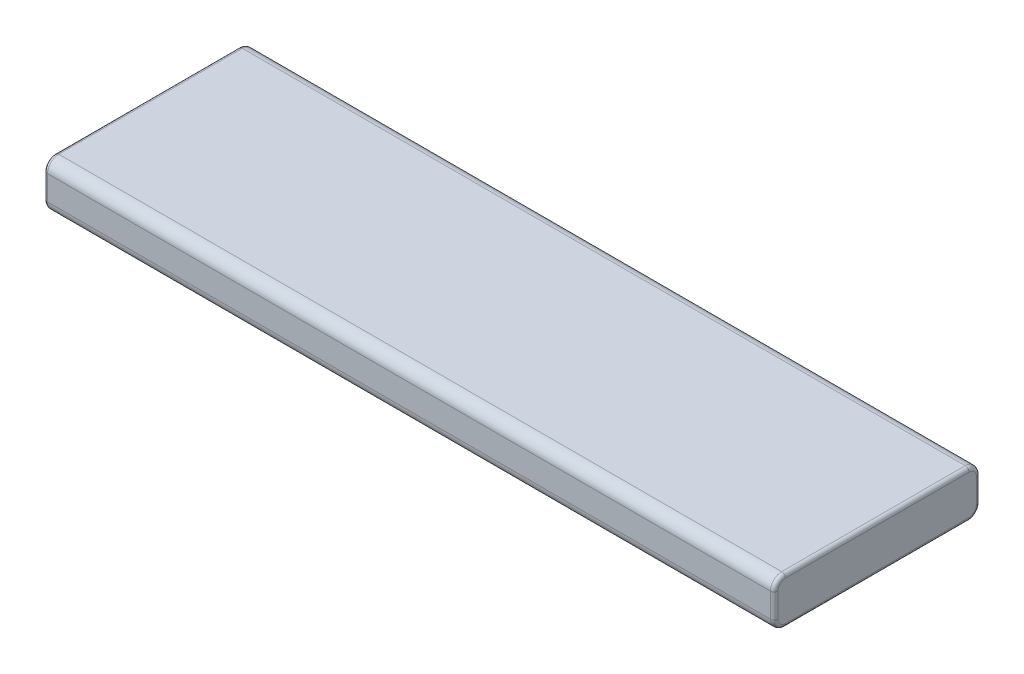
ISO-10303-21;
HEADER;
FILE_DESCRIPTION(('STEP AP214'),'2;1');
FILE_NAME('part.step','',(''),(''),'','','');
FILE_SCHEMA(('AUTOMOTIVE_DESIGN { 1 0 10303 214 1 1 1 1 }'));
ENDSEC;
DATA;
#1=APPLICATION_CONTEXT('core data for automotive mechanical design processes');
#2=APPLICATION_PROTOCOL_DEFINITION('international standard','automotive_design',2000,#1);
#3=PRODUCT_CONTEXT('',#1,'mechanical');
#4=PRODUCT('Part','Part','',(#3));
#5=PRODUCT_RELATED_PRODUCT_CATEGORY('part','',(#4));
#6=PRODUCT_DEFINITION_FORMATION('','',#4);
#7=PRODUCT_DEFINITION_CONTEXT('part definition',#1,'design');
#8=PRODUCT_DEFINITION('design','',#6,#7);
#9=PRODUCT_DEFINITION_SHAPE('','',#8);
#10=(LENGTH_UNIT() NAMED_UNIT(*) SI_UNIT(.MILLI.,.METRE.));
#11=(NAMED_UNIT(*) PLANE_ANGLE_UNIT() SI_UNIT($,.RADIAN.));
#12=(NAMED_UNIT(*) SI_UNIT($,.STERADIAN.) SOLID_ANGLE_UNIT());
#13=UNCERTAINTY_MEASURE_WITH_UNIT(LENGTH_MEASURE(1.E-05),#10,'distance_accuracy_value','');
#14=(GEOMETRIC_REPRESENTATION_CONTEXT(3) GLOBAL_UNCERTAINTY_ASSIGNED_CONTEXT((#13)) GLOBAL_UNIT_ASSIGNED_CONTEXT((#10,
#11,#12)) REPRESENTATION_CONTEXT('',''));
#15=CARTESIAN_POINT('',(0.,0.,0.));
#16=DIRECTION('',(0.,0.,1.));
#17=DIRECTION('',(1.,0.,0.));
#18=AXIS2_PLACEMENT_3D('',#15,#16,#17);
#19=CARTESIAN_POINT('',(0.,5.,0.));
#20=DIRECTION('',(1.,0.,0.));
#21=DIRECTION('',(0.,0.,-1.));
#22=AXIS2_PLACEMENT_3D('',#19,#20,#21);
#23=PLANE('',#22);
#24=DIRECTION('',(0.,0.,1.));
#25=VECTOR('',#24,1.);
#26=CARTESIAN_POINT('',(0.,4.6,0.));
#27=LINE('',#26,#25);
#28=CARTESIAN_POINT('',(0.,4.6,-1.2));
#29=VERTEX_POINT('',#28);
#30=CARTESIAN_POINT('',(0.,4.6,-20.8));
#31=VERTEX_POINT('',#30);
#32=EDGE_CURVE('E225',#29,#31,#27,.F.);
#33=ORIENTED_EDGE('',*,*,#32,.T.);
#34=CARTESIAN_POINT('',(0.,3.8,-20.8));
#35=DIRECTION('',(1.,0.,0.));
#36=DIRECTION('',(0.,0.,-1.));
#37=AXIS2_PLACEMENT_3D('',#34,#35,#36);
#38=CIRCLE('',#37,0.8);
#39=CARTESIAN_POINT('',(0.,3.8,-21.6));
#40=VERTEX_POINT('',#39);
#41=EDGE_CURVE('E238',#31,#40,#38,.F.);
#42=ORIENTED_EDGE('',*,*,#41,.T.);
#43=DIRECTION('',(0.,-1.,0.));
#44=VECTOR('',#43,1.);
#45=CARTESIAN_POINT('',(0.,5.,-21.6));
#46=LINE('',#45,#44);
#47=CARTESIAN_POINT('',(0.,1.2,-21.6));
#48=VERTEX_POINT('',#47);
#49=EDGE_CURVE('E61',#40,#48,#46,.T.);
#50=ORIENTED_EDGE('',*,*,#49,.T.);
#51=CARTESIAN_POINT('',(0.,1.2,-20.8));
#52=DIRECTION('',(1.,0.,0.));
#53=DIRECTION('',(0.,0.,-1.));
#54=AXIS2_PLACEMENT_3D('',#51,#52,#53);
#55=CIRCLE('',#54,0.8);
#56=CARTESIAN_POINT('',(0.,0.4,-20.8));
#57=VERTEX_POINT('',#56);
#58=EDGE_CURVE('E235',#48,#57,#55,.F.);
#59=ORIENTED_EDGE('',*,*,#58,.T.);
#60=DIRECTION('',(0.,0.,1.));
#61=VECTOR('',#60,1.);
#62=CARTESIAN_POINT('',(0.,0.4,-1.2));
#63=LINE('',#62,#61);
#64=CARTESIAN_POINT('',(0.,0.4,-1.2));
#65=VERTEX_POINT('',#64);
#66=EDGE_CURVE('E233',#57,#65,#63,.T.);
#67=ORIENTED_EDGE('',*,*,#66,.T.);
#68=CARTESIAN_POINT('',(0.,1.2,-1.2));
#69=DIRECTION('',(1.,0.,0.));
#70=DIRECTION('',(0.,0.,-1.));
#71=AXIS2_PLACEMENT_3D('',#68,#69,#70);
#72=CIRCLE('',#71,0.8);
#73=CARTESIAN_POINT('',(0.,1.2,-0.4));
#74=VERTEX_POINT('',#73);
#75=EDGE_CURVE('E231',#65,#74,#72,.F.);
#76=ORIENTED_EDGE('',*,*,#75,.T.);
#77=DIRECTION('',(0.,-1.,0.));
#78=VECTOR('',#77,1.);
#79=CARTESIAN_POINT('',(0.,5.,-0.4));
#80=LINE('',#79,#78);
#81=CARTESIAN_POINT('',(0.,3.8,-0.4));
#82=VERTEX_POINT('',#81);
#83=EDGE_CURVE('E229',#74,#82,#80,.F.);
#84=ORIENTED_EDGE('',*,*,#83,.T.);
#85=CARTESIAN_POINT('',(0.,3.8,-1.2));
#86=DIRECTION('',(1.,0.,0.));
#87=DIRECTION('',(0.,0.,-1.));
#88=AXIS2_PLACEMENT_3D('',#85,#86,#87);
#89=CIRCLE('',#88,0.8);
#90=EDGE_CURVE('E227',#82,#29,#89,.F.);
#91=ORIENTED_EDGE('',*,*,#90,.T.);
#92=EDGE_LOOP('',(#33,#42,#50,#59,#67,#76,#84,#91));
#93=FACE_BOUND('',#92,.T.);
#94=ADVANCED_FACE('F37',(#93),#23,.F.);
#95=CARTESIAN_POINT('',(0.,5.,0.));
#96=DIRECTION('',(0.,0.,-1.));
#97=DIRECTION('',(-1.,0.,0.));
#98=AXIS2_PLACEMENT_3D('',#95,#96,#97);
#99=PLANE('',#98);
#100=DIRECTION('',(1.,0.,0.));
#101=VECTOR('',#100,1.);
#102=CARTESIAN_POINT('',(78.,1.2,0.));
#103=LINE('',#102,#101);
#104=CARTESIAN_POINT('',(0.399999999999998,1.2,0.));
#105=VERTEX_POINT('',#104);
#106=CARTESIAN_POINT('',(77.6,1.2,0.));
#107=VERTEX_POINT('',#106);
#108=EDGE_CURVE('E178',#105,#107,#103,.T.);
#109=ORIENTED_EDGE('',*,*,#108,.T.);
#110=DIRECTION('',(0.,-1.,0.));
#111=VECTOR('',#110,1.);
#112=CARTESIAN_POINT('',(77.6,5.,0.));
#113=LINE('',#112,#111);
#114=CARTESIAN_POINT('',(77.6,3.8,0.));
#115=VERTEX_POINT('',#114);
#116=EDGE_CURVE('E203',#107,#115,#113,.F.);
#117=ORIENTED_EDGE('',*,*,#116,.T.);
#118=DIRECTION('',(1.,0.,0.));
#119=VECTOR('',#118,1.);
#120=CARTESIAN_POINT('',(0.,3.8,0.));
#121=LINE('',#120,#119);
#122=CARTESIAN_POINT('',(0.4,3.8,0.));
#123=VERTEX_POINT('',#122);
#124=EDGE_CURVE('E181',#115,#123,#121,.F.);
#125=ORIENTED_EDGE('',*,*,#124,.T.);
#126=DIRECTION('',(0.,-1.,0.));
#127=VECTOR('',#126,1.);
#128=CARTESIAN_POINT('',(0.4,5.,0.));
#129=LINE('',#128,#127);
#130=EDGE_CURVE('E201',#123,#105,#129,.T.);
#131=ORIENTED_EDGE('',*,*,#130,.T.);
#132=EDGE_LOOP('',(#109,#117,#125,#131));
#133=FACE_BOUND('',#132,.T.);
#134=ADVANCED_FACE('F315',(#133),#99,.F.);
#135=CARTESIAN_POINT('',(78.,5.,0.));
#136=DIRECTION('',(-1.,0.,0.));
#137=DIRECTION('',(0.,0.,1.));
#138=AXIS2_PLACEMENT_3D('',#135,#136,#137);
#139=PLANE('',#138);
#140=DIRECTION('',(0.,0.,-1.));
#141=VECTOR('',#140,1.);
#142=CARTESIAN_POINT('',(78.,4.6,0.));
#143=LINE('',#142,#141);
#144=CARTESIAN_POINT('',(78.,4.6,-20.8));
#145=VERTEX_POINT('',#144);
#146=CARTESIAN_POINT('',(78.,4.6,-1.2));
#147=VERTEX_POINT('',#146);
#148=EDGE_CURVE('E157',#145,#147,#143,.F.);
#149=ORIENTED_EDGE('',*,*,#148,.T.);
#150=CARTESIAN_POINT('',(78.,3.8,-1.2));
#151=DIRECTION('',(-1.,0.,0.));
#152=DIRECTION('',(0.,0.,1.));
#153=AXIS2_PLACEMENT_3D('',#150,#151,#152);
#154=CIRCLE('',#153,0.8);
#155=CARTESIAN_POINT('',(78.,3.8,-0.4));
#156=VERTEX_POINT('',#155);
#157=EDGE_CURVE('E194',#147,#156,#154,.F.);
#158=ORIENTED_EDGE('',*,*,#157,.T.);
#159=DIRECTION('',(0.,-1.,0.));
#160=VECTOR('',#159,1.);
#161=CARTESIAN_POINT('',(78.,5.,-0.4));
#162=LINE('',#161,#160);
#163=CARTESIAN_POINT('',(78.,1.2,-0.4));
#164=VERTEX_POINT('',#163);
#165=EDGE_CURVE('E192',#156,#164,#162,.T.);
#166=ORIENTED_EDGE('',*,*,#165,.T.);
#167=CARTESIAN_POINT('',(78.,1.2,-1.2));
#168=DIRECTION('',(-1.,0.,0.));
#169=DIRECTION('',(0.,0.,1.));
#170=AXIS2_PLACEMENT_3D('',#167,#168,#169);
#171=CIRCLE('',#170,0.8);
#172=CARTESIAN_POINT('',(78.,0.4,-1.2));
#173=VERTEX_POINT('',#172);
#174=EDGE_CURVE('E190',#164,#173,#171,.F.);
#175=ORIENTED_EDGE('',*,*,#174,.T.);
#176=DIRECTION('',(0.,0.,-1.));
#177=VECTOR('',#176,1.);
#178=CARTESIAN_POINT('',(78.,0.4,-20.8));
#179=LINE('',#178,#177);
#180=CARTESIAN_POINT('',(78.,0.4,-20.8));
#181=VERTEX_POINT('',#180);
#182=EDGE_CURVE('E188',#173,#181,#179,.T.);
#183=ORIENTED_EDGE('',*,*,#182,.T.);
#184=CARTESIAN_POINT('',(78.,1.2,-20.8));
#185=DIRECTION('',(-1.,0.,0.));
#186=DIRECTION('',(0.,0.,1.));
#187=AXIS2_PLACEMENT_3D('',#184,#185,#186);
#188=CIRCLE('',#187,0.8);
#189=CARTESIAN_POINT('',(78.,1.2,-21.6));
#190=VERTEX_POINT('',#189);
#191=EDGE_CURVE('E186',#181,#190,#188,.F.);
#192=ORIENTED_EDGE('',*,*,#191,.T.);
#193=DIRECTION('',(0.,-1.,0.));
#194=VECTOR('',#193,1.);
#195=CARTESIAN_POINT('',(78.,5.,-21.6));
#196=LINE('',#195,#194);
#197=CARTESIAN_POINT('',(78.,3.8,-21.6));
#198=VERTEX_POINT('',#197);
#199=EDGE_CURVE('E160',#190,#198,#196,.F.);
#200=ORIENTED_EDGE('',*,*,#199,.T.);
#201=CARTESIAN_POINT('',(78.,3.8,-20.8));
#202=DIRECTION('',(-1.,0.,0.));
#203=DIRECTION('',(0.,0.,1.));
#204=AXIS2_PLACEMENT_3D('',#201,#202,#203);
#205=CIRCLE('',#204,0.8);
#206=EDGE_CURVE('E152',#198,#145,#205,.F.);
#207=ORIENTED_EDGE('',*,*,#206,.T.);
#208=EDGE_LOOP('',(#149,#158,#166,#175,#183,#192,#200,#207));
#209=FACE_BOUND('',#208,.T.);
#210=ADVANCED_FACE('F154',(#209),#139,.F.);
#211=CARTESIAN_POINT('',(0.,5.,-22.));
#212=DIRECTION('',(0.,0.,1.));
#213=DIRECTION('',(1.,0.,0.));
#214=AXIS2_PLACEMENT_3D('',#211,#212,#213);
#215=PLANE('',#214);
#216=DIRECTION('',(-1.,0.,0.));
#217=VECTOR('',#216,1.);
#218=CARTESIAN_POINT('',(0.,3.8,-22.));
#219=LINE('',#218,#217);
#220=CARTESIAN_POINT('',(0.4,3.8,-22.));
#221=VERTEX_POINT('',#220);
#222=CARTESIAN_POINT('',(77.6,3.8,-22.));
#223=VERTEX_POINT('',#222);
#224=EDGE_CURVE('E256',#221,#223,#219,.F.);
#225=ORIENTED_EDGE('',*,*,#224,.T.);
#226=DIRECTION('',(0.,-1.,0.));
#227=VECTOR('',#226,1.);
#228=CARTESIAN_POINT('',(77.6,5.,-22.));
#229=LINE('',#228,#227);
#230=CARTESIAN_POINT('',(77.6,1.2,-22.));
#231=VERTEX_POINT('',#230);
#232=EDGE_CURVE('E219',#223,#231,#229,.T.);
#233=ORIENTED_EDGE('',*,*,#232,.T.);
#234=DIRECTION('',(-1.,0.,0.));
#235=VECTOR('',#234,1.);
#236=CARTESIAN_POINT('',(0.,1.2,-22.));
#237=LINE('',#236,#235);
#238=CARTESIAN_POINT('',(0.4,1.2,-22.));
#239=VERTEX_POINT('',#238);
#240=EDGE_CURVE('E300',#231,#239,#237,.T.);
#241=ORIENTED_EDGE('',*,*,#240,.T.);
#242=DIRECTION('',(0.,-1.,0.));
#243=VECTOR('',#242,1.);
#244=CARTESIAN_POINT('',(0.4,5.,-22.));
#245=LINE('',#244,#243);
#246=EDGE_CURVE('E217',#239,#221,#245,.F.);
#247=ORIENTED_EDGE('',*,*,#246,.T.);
#248=EDGE_LOOP('',(#225,#233,#241,#247));
#249=FACE_BOUND('',#248,.T.);
#250=ADVANCED_FACE('F348',(#249),#215,.F.);
#251=CARTESIAN_POINT('',(0.,5.,0.));
#252=DIRECTION('',(0.,-1.,0.));
#253=DIRECTION('',(0.,0.,-1.));
#254=AXIS2_PLACEMENT_3D('',#251,#252,#253);
#255=PLANE('',#254);
#256=DIRECTION('',(1.,0.,0.));
#257=VECTOR('',#256,1.);
#258=CARTESIAN_POINT('',(0.,5.,-1.2));
#259=LINE('',#258,#257);
#260=CARTESIAN_POINT('',(0.4,5.,-1.2));
#261=VERTEX_POINT('',#260);
#262=CARTESIAN_POINT('',(77.6,5.,-1.2));
#263=VERTEX_POINT('',#262);
#264=EDGE_CURVE('E302',#261,#263,#259,.T.);
#265=ORIENTED_EDGE('',*,*,#264,.T.);
#266=DIRECTION('',(0.,0.,-1.));
#267=VECTOR('',#266,1.);
#268=CARTESIAN_POINT('',(77.6,5.,0.));
#269=LINE('',#268,#267);
#270=CARTESIAN_POINT('',(77.6,5.,-20.8));
#271=VERTEX_POINT('',#270);
#272=EDGE_CURVE('E11',#263,#271,#269,.T.);
#273=ORIENTED_EDGE('',*,*,#272,.T.);
#274=DIRECTION('',(-1.,0.,0.));
#275=VECTOR('',#274,1.);
#276=CARTESIAN_POINT('',(0.,5.,-20.8));
#277=LINE('',#276,#275);
#278=CARTESIAN_POINT('',(0.4,5.,-20.8));
#279=VERTEX_POINT('',#278);
#280=EDGE_CURVE('E310',#271,#279,#277,.T.);
#281=ORIENTED_EDGE('',*,*,#280,.T.);
#282=DIRECTION('',(0.,0.,1.));
#283=VECTOR('',#282,1.);
#284=CARTESIAN_POINT('',(0.4,5.,0.));
#285=LINE('',#284,#283);
#286=EDGE_CURVE('E46',#279,#261,#285,.T.);
#287=ORIENTED_EDGE('',*,*,#286,.T.);
#288=EDGE_LOOP('',(#265,#273,#281,#287));
#289=FACE_BOUND('',#288,.T.);
#290=ADVANCED_FACE('F371',(#289),#255,.F.);
#291=CARTESIAN_POINT('',(0.,0.,0.));
#292=DIRECTION('',(0.,-1.,0.));
#293=DIRECTION('',(0.,0.,-1.));
#294=AXIS2_PLACEMENT_3D('',#291,#292,#293);
#295=PLANE('',#294);
#296=DIRECTION('',(-1.,0.,0.));
#297=VECTOR('',#296,1.);
#298=CARTESIAN_POINT('',(78.,0.,-20.8));
#299=LINE('',#298,#297);
#300=CARTESIAN_POINT('',(0.399999999999998,0.,-20.8));
#301=VERTEX_POINT('',#300);
#302=CARTESIAN_POINT('',(77.6,0.,-20.8));
#303=VERTEX_POINT('',#302);
#304=EDGE_CURVE('E299',#301,#303,#299,.F.);
#305=ORIENTED_EDGE('',*,*,#304,.T.);
#306=DIRECTION('',(0.,0.,-1.));
#307=VECTOR('',#306,1.);
#308=CARTESIAN_POINT('',(77.6,0.,-1.2));
#309=LINE('',#308,#307);
#310=CARTESIAN_POINT('',(77.6,0.,-1.2));
#311=VERTEX_POINT('',#310);
#312=EDGE_CURVE('E211',#303,#311,#309,.F.);
#313=ORIENTED_EDGE('',*,*,#312,.T.);
#314=DIRECTION('',(1.,0.,0.));
#315=VECTOR('',#314,1.);
#316=CARTESIAN_POINT('',(0.,0.,-1.2));
#317=LINE('',#316,#315);
#318=CARTESIAN_POINT('',(0.4,0.,-1.2));
#319=VERTEX_POINT('',#318);
#320=EDGE_CURVE('E292',#311,#319,#317,.F.);
#321=ORIENTED_EDGE('',*,*,#320,.T.);
#322=DIRECTION('',(0.,0.,1.));
#323=VECTOR('',#322,1.);
#324=CARTESIAN_POINT('',(0.4,0.,-20.8));
#325=LINE('',#324,#323);
#326=EDGE_CURVE('E209',#319,#301,#325,.F.);
#327=ORIENTED_EDGE('',*,*,#326,.T.);
#328=EDGE_LOOP('',(#305,#313,#321,#327));
#329=FACE_BOUND('',#328,.T.);
#330=ADVANCED_FACE('F296',(#329),#295,.T.);
#331=CARTESIAN_POINT('',(0.,1.2,-20.8));
#332=DIRECTION('',(1.,0.,0.));
#333=DIRECTION('',(0.,0.,-1.));
#334=AXIS2_PLACEMENT_3D('',#331,#332,#333);
#335=CYLINDRICAL_SURFACE('',#334,1.2);
#336=ORIENTED_EDGE('',*,*,#240,.F.);
#337=CARTESIAN_POINT('',(77.6,1.2,-20.8));
#338=DIRECTION('',(-1.,0.,0.));
#339=DIRECTION('',(0.,0.,1.));
#340=AXIS2_PLACEMENT_3D('',#337,#338,#339);
#341=CIRCLE('',#340,1.2);
#342=EDGE_CURVE('E215',#231,#303,#341,.T.);
#343=ORIENTED_EDGE('',*,*,#342,.T.);
#344=ORIENTED_EDGE('',*,*,#304,.F.);
#345=CARTESIAN_POINT('',(0.4,1.2,-20.8));
#346=DIRECTION('',(1.,0.,0.));
#347=DIRECTION('',(0.,0.,-1.));
#348=AXIS2_PLACEMENT_3D('',#345,#346,#347);
#349=CIRCLE('',#348,1.2);
#350=EDGE_CURVE('E213',#301,#239,#349,.T.);
#351=ORIENTED_EDGE('',*,*,#350,.T.);
#352=EDGE_LOOP('',(#336,#343,#344,#351));
#353=FACE_BOUND('',#352,.T.);
#354=ADVANCED_FACE('F352',(#353),#335,.T.);
#355=CARTESIAN_POINT('',(0.,3.8,-20.8));
#356=DIRECTION('',(-1.,0.,0.));
#357=DIRECTION('',(0.,0.,1.));
#358=AXIS2_PLACEMENT_3D('',#355,#356,#357);
#359=CYLINDRICAL_SURFACE('',#358,1.2);
#360=ORIENTED_EDGE('',*,*,#280,.F.);
#361=CARTESIAN_POINT('',(77.6,3.8,-20.8));
#362=DIRECTION('',(-1.,0.,0.));
#363=DIRECTION('',(0.,0.,1.));
#364=AXIS2_PLACEMENT_3D('',#361,#362,#363);
#365=CIRCLE('',#364,1.2);
#366=EDGE_CURVE('E169',#271,#223,#365,.T.);
#367=ORIENTED_EDGE('',*,*,#366,.T.);
#368=ORIENTED_EDGE('',*,*,#224,.F.);
#369=CARTESIAN_POINT('',(0.4,3.8,-20.8));
#370=DIRECTION('',(1.,0.,0.));
#371=DIRECTION('',(0.,0.,-1.));
#372=AXIS2_PLACEMENT_3D('',#369,#370,#371);
#373=CIRCLE('',#372,1.2);
#374=EDGE_CURVE('E221',#221,#279,#373,.T.);
#375=ORIENTED_EDGE('',*,*,#374,.T.);
#376=EDGE_LOOP('',(#360,#367,#368,#375));
#377=FACE_BOUND('',#376,.T.);
#378=ADVANCED_FACE('F362',(#377),#359,.T.);
#379=CARTESIAN_POINT('',(0.,1.2,-1.2));
#380=DIRECTION('',(-1.,0.,0.));
#381=DIRECTION('',(0.,0.,1.));
#382=AXIS2_PLACEMENT_3D('',#379,#380,#381);
#383=CYLINDRICAL_SURFACE('',#382,1.2);
#384=ORIENTED_EDGE('',*,*,#320,.F.);
#385=CARTESIAN_POINT('',(77.6,1.2,-1.2));
#386=DIRECTION('',(-1.,0.,0.));
#387=DIRECTION('',(0.,0.,1.));
#388=AXIS2_PLACEMENT_3D('',#385,#386,#387);
#389=CIRCLE('',#388,1.2);
#390=EDGE_CURVE('E207',#311,#107,#389,.T.);
#391=ORIENTED_EDGE('',*,*,#390,.T.);
#392=ORIENTED_EDGE('',*,*,#108,.F.);
#393=CARTESIAN_POINT('',(0.4,1.2,-1.2));
#394=DIRECTION('',(1.,0.,0.));
#395=DIRECTION('',(0.,0.,-1.));
#396=AXIS2_PLACEMENT_3D('',#393,#394,#395);
#397=CIRCLE('',#396,1.2);
#398=EDGE_CURVE('E205',#105,#319,#397,.T.);
#399=ORIENTED_EDGE('',*,*,#398,.T.);
#400=EDGE_LOOP('',(#384,#391,#392,#399));
#401=FACE_BOUND('',#400,.T.);
#402=ADVANCED_FACE('F291',(#401),#383,.T.);
#403=CARTESIAN_POINT('',(0.,3.8,-1.2));
#404=DIRECTION('',(1.,0.,0.));
#405=DIRECTION('',(0.,0.,-1.));
#406=AXIS2_PLACEMENT_3D('',#403,#404,#405);
#407=CYLINDRICAL_SURFACE('',#406,1.2);
#408=ORIENTED_EDGE('',*,*,#124,.F.);
#409=CARTESIAN_POINT('',(77.6,3.8,-1.2));
#410=DIRECTION('',(-1.,0.,0.));
#411=DIRECTION('',(0.,0.,1.));
#412=AXIS2_PLACEMENT_3D('',#409,#410,#411);
#413=CIRCLE('',#412,1.2);
#414=EDGE_CURVE('E198',#115,#263,#413,.T.);
#415=ORIENTED_EDGE('',*,*,#414,.T.);
#416=ORIENTED_EDGE('',*,*,#264,.F.);
#417=CARTESIAN_POINT('',(0.4,3.8,-1.2));
#418=DIRECTION('',(1.,0.,0.));
#419=DIRECTION('',(0.,0.,-1.));
#420=AXIS2_PLACEMENT_3D('',#417,#418,#419);
#421=CIRCLE('',#420,1.2);
#422=EDGE_CURVE('E196',#261,#123,#421,.T.);
#423=ORIENTED_EDGE('',*,*,#422,.T.);
#424=EDGE_LOOP('',(#408,#415,#416,#423));
#425=FACE_BOUND('',#424,.T.);
#426=ADVANCED_FACE('F319',(#425),#407,.T.);
#427=CARTESIAN_POINT('',(77.6,1.2,-20.8));
#428=DIRECTION('',(-1.,0.,0.));
#429=DIRECTION('',(0.,0.,1.));
#430=AXIS2_PLACEMENT_3D('',#427,#428,#429);
#431=TOROIDAL_SURFACE('',#430,0.8,0.4);
#432=CARTESIAN_POINT('',(77.6,0.4,-20.8));
#433=DIRECTION('',(0.,0.,1.));
#434=DIRECTION('',(1.,0.,0.));
#435=AXIS2_PLACEMENT_3D('',#432,#433,#434);
#436=CIRCLE('',#435,0.4);
#437=EDGE_CURVE('E250',#303,#181,#436,.T.);
#438=ORIENTED_EDGE('',*,*,#437,.F.);
#439=ORIENTED_EDGE('',*,*,#342,.F.);
#440=CARTESIAN_POINT('',(77.6,1.2,-21.6));
#441=DIRECTION('',(0.,1.,0.));
#442=DIRECTION('',(0.,0.,1.));
#443=AXIS2_PLACEMENT_3D('',#440,#441,#442);
#444=CIRCLE('',#443,0.4);
#445=EDGE_CURVE('E253',#190,#231,#444,.T.);
#446=ORIENTED_EDGE('',*,*,#445,.F.);
#447=ORIENTED_EDGE('',*,*,#191,.F.);
#448=EDGE_LOOP('',(#438,#439,#446,#447));
#449=FACE_BOUND('',#448,.T.);
#450=ADVANCED_FACE('F340',(#449),#431,.T.);
#451=CARTESIAN_POINT('',(77.6,5.,-21.6));
#452=DIRECTION('',(0.,-1.,0.));
#453=DIRECTION('',(0.,0.,-1.));
#454=AXIS2_PLACEMENT_3D('',#451,#452,#453);
#455=CYLINDRICAL_SURFACE('',#454,0.4);
#456=ORIENTED_EDGE('',*,*,#445,.T.);
#457=ORIENTED_EDGE('',*,*,#232,.F.);
#458=CARTESIAN_POINT('',(77.6,3.8,-21.6));
#459=DIRECTION('',(0.,1.,0.));
#460=DIRECTION('',(0.,0.,1.));
#461=AXIS2_PLACEMENT_3D('',#458,#459,#460);
#462=CIRCLE('',#461,0.4);
#463=EDGE_CURVE('E248',#198,#223,#462,.T.);
#464=ORIENTED_EDGE('',*,*,#463,.F.);
#465=ORIENTED_EDGE('',*,*,#199,.F.);
#466=EDGE_LOOP('',(#456,#457,#464,#465));
#467=FACE_BOUND('',#466,.T.);
#468=ADVANCED_FACE('F344',(#467),#455,.T.);
#469=CARTESIAN_POINT('',(77.6,0.4,0.));
#470=DIRECTION('',(0.,0.,1.));
#471=DIRECTION('',(1.,0.,0.));
#472=AXIS2_PLACEMENT_3D('',#469,#470,#471);
#473=CYLINDRICAL_SURFACE('',#472,0.4);
#474=ORIENTED_EDGE('',*,*,#437,.T.);
#475=ORIENTED_EDGE('',*,*,#182,.F.);
#476=CARTESIAN_POINT('',(77.6,0.4,-1.2));
#477=DIRECTION('',(0.,0.,1.));
#478=DIRECTION('',(1.,0.,0.));
#479=AXIS2_PLACEMENT_3D('',#476,#477,#478);
#480=CIRCLE('',#479,0.4);
#481=EDGE_CURVE('E172',#311,#173,#480,.T.);
#482=ORIENTED_EDGE('',*,*,#481,.F.);
#483=ORIENTED_EDGE('',*,*,#312,.F.);
#484=EDGE_LOOP('',(#474,#475,#482,#483));
#485=FACE_BOUND('',#484,.T.);
#486=ADVANCED_FACE('F335',(#485),#473,.T.);
#487=CARTESIAN_POINT('',(77.6,3.8,-20.8));
#488=DIRECTION('',(-1.,0.,0.));
#489=DIRECTION('',(0.,0.,1.));
#490=AXIS2_PLACEMENT_3D('',#487,#488,#489);
#491=TOROIDAL_SURFACE('',#490,0.8,0.4);
#492=ORIENTED_EDGE('',*,*,#463,.T.);
#493=ORIENTED_EDGE('',*,*,#366,.F.);
#494=CARTESIAN_POINT('',(77.6,4.6,-20.8));
#495=DIRECTION('',(0.,0.,1.));
#496=DIRECTION('',(1.,0.,0.));
#497=AXIS2_PLACEMENT_3D('',#494,#495,#496);
#498=CIRCLE('',#497,0.4);
#499=EDGE_CURVE('E167',#145,#271,#498,.T.);
#500=ORIENTED_EDGE('',*,*,#499,.F.);
#501=ORIENTED_EDGE('',*,*,#206,.F.);
#502=EDGE_LOOP('',(#492,#493,#500,#501));
#503=FACE_BOUND('',#502,.T.);
#504=ADVANCED_FACE('F168',(#503),#491,.T.);
#505=CARTESIAN_POINT('',(77.6,1.2,-1.2));
#506=DIRECTION('',(-1.,0.,0.));
#507=DIRECTION('',(0.,0.,1.));
#508=AXIS2_PLACEMENT_3D('',#505,#506,#507);
#509=TOROIDAL_SURFACE('',#508,0.8,0.4);
#510=ORIENTED_EDGE('',*,*,#481,.T.);
#511=ORIENTED_EDGE('',*,*,#174,.F.);
#512=CARTESIAN_POINT('',(77.6,1.2,-0.4));
#513=DIRECTION('',(0.,1.,0.));
#514=DIRECTION('',(0.,0.,1.));
#515=AXIS2_PLACEMENT_3D('',#512,#513,#514);
#516=CIRCLE('',#515,0.4);
#517=EDGE_CURVE('E173',#107,#164,#516,.T.);
#518=ORIENTED_EDGE('',*,*,#517,.F.);
#519=ORIENTED_EDGE('',*,*,#390,.F.);
#520=EDGE_LOOP('',(#510,#511,#518,#519));
#521=FACE_BOUND('',#520,.T.);
#522=ADVANCED_FACE('F332',(#521),#509,.T.);
#523=CARTESIAN_POINT('',(77.6,4.6,0.));
#524=DIRECTION('',(0.,0.,-1.));
#525=DIRECTION('',(-1.,0.,0.));
#526=AXIS2_PLACEMENT_3D('',#523,#524,#525);
#527=CYLINDRICAL_SURFACE('',#526,0.4);
#528=ORIENTED_EDGE('',*,*,#499,.T.);
#529=ORIENTED_EDGE('',*,*,#272,.F.);
#530=CARTESIAN_POINT('',(77.6,4.6,-1.2));
#531=DIRECTION('',(0.,0.,1.));
#532=DIRECTION('',(1.,0.,0.));
#533=AXIS2_PLACEMENT_3D('',#530,#531,#532);
#534=CIRCLE('',#533,0.4);
#535=EDGE_CURVE('E176',#147,#263,#534,.T.);
#536=ORIENTED_EDGE('',*,*,#535,.F.);
#537=ORIENTED_EDGE('',*,*,#148,.F.);
#538=EDGE_LOOP('',(#528,#529,#536,#537));
#539=FACE_BOUND('',#538,.T.);
#540=ADVANCED_FACE('F175',(#539),#527,.T.);
#541=CARTESIAN_POINT('',(77.6,5.,-0.4));
#542=DIRECTION('',(0.,-1.,0.));
#543=DIRECTION('',(0.,0.,-1.));
#544=AXIS2_PLACEMENT_3D('',#541,#542,#543);
#545=CYLINDRICAL_SURFACE('',#544,0.4);
#546=ORIENTED_EDGE('',*,*,#517,.T.);
#547=ORIENTED_EDGE('',*,*,#165,.F.);
#548=CARTESIAN_POINT('',(77.6,3.8,-0.4));
#549=DIRECTION('',(0.,1.,0.));
#550=DIRECTION('',(0.,0.,1.));
#551=AXIS2_PLACEMENT_3D('',#548,#549,#550);
#552=CIRCLE('',#551,0.4);
#553=EDGE_CURVE('E241',#115,#156,#552,.T.);
#554=ORIENTED_EDGE('',*,*,#553,.F.);
#555=ORIENTED_EDGE('',*,*,#116,.F.);
#556=EDGE_LOOP('',(#546,#547,#554,#555));
#557=FACE_BOUND('',#556,.T.);
#558=ADVANCED_FACE('F327',(#557),#545,.T.);
#559=CARTESIAN_POINT('',(77.6,3.8,-1.2));
#560=DIRECTION('',(-1.,0.,0.));
#561=DIRECTION('',(0.,0.,1.));
#562=AXIS2_PLACEMENT_3D('',#559,#560,#561);
#563=TOROIDAL_SURFACE('',#562,0.8,0.4);
#564=ORIENTED_EDGE('',*,*,#535,.T.);
#565=ORIENTED_EDGE('',*,*,#414,.F.);
#566=ORIENTED_EDGE('',*,*,#553,.T.);
#567=ORIENTED_EDGE('',*,*,#157,.F.);
#568=EDGE_LOOP('',(#564,#565,#566,#567));
#569=FACE_BOUND('',#568,.T.);
#570=ADVANCED_FACE('F324',(#569),#563,.T.);
#571=CARTESIAN_POINT('',(0.4,1.2,-1.2));
#572=DIRECTION('',(1.,0.,0.));
#573=DIRECTION('',(0.,0.,-1.));
#574=AXIS2_PLACEMENT_3D('',#571,#572,#573);
#575=TOROIDAL_SURFACE('',#574,0.8,0.4);
#576=CARTESIAN_POINT('',(0.4,0.4,-1.2));
#577=DIRECTION('',(0.,0.,-1.));
#578=DIRECTION('',(-1.,0.,0.));
#579=AXIS2_PLACEMENT_3D('',#576,#577,#578);
#580=CIRCLE('',#579,0.4);
#581=EDGE_CURVE('E271',#319,#65,#580,.T.);
#582=ORIENTED_EDGE('',*,*,#581,.F.);
#583=ORIENTED_EDGE('',*,*,#398,.F.);
#584=CARTESIAN_POINT('',(0.4,1.2,-0.4));
#585=DIRECTION('',(0.,1.,0.));
#586=DIRECTION('',(0.,0.,1.));
#587=AXIS2_PLACEMENT_3D('',#584,#585,#586);
#588=CIRCLE('',#587,0.4);
#589=EDGE_CURVE('E41',#74,#105,#588,.T.);
#590=ORIENTED_EDGE('',*,*,#589,.F.);
#591=ORIENTED_EDGE('',*,*,#75,.F.);
#592=EDGE_LOOP('',(#582,#583,#590,#591));
#593=FACE_BOUND('',#592,.T.);
#594=ADVANCED_FACE('F39',(#593),#575,.T.);
#595=CARTESIAN_POINT('',(0.4,5.,-0.4));
#596=DIRECTION('',(0.,-1.,0.));
#597=DIRECTION('',(0.,0.,-1.));
#598=AXIS2_PLACEMENT_3D('',#595,#596,#597);
#599=CYLINDRICAL_SURFACE('',#598,0.4);
#600=ORIENTED_EDGE('',*,*,#589,.T.);
#601=ORIENTED_EDGE('',*,*,#130,.F.);
#602=CARTESIAN_POINT('',(0.4,3.8,-0.4));
#603=DIRECTION('',(0.,1.,0.));
#604=DIRECTION('',(0.,0.,1.));
#605=AXIS2_PLACEMENT_3D('',#602,#603,#604);
#606=CIRCLE('',#605,0.4);
#607=EDGE_CURVE('E269',#82,#123,#606,.T.);
#608=ORIENTED_EDGE('',*,*,#607,.F.);
#609=ORIENTED_EDGE('',*,*,#83,.F.);
#610=EDGE_LOOP('',(#600,#601,#608,#609));
#611=FACE_BOUND('',#610,.T.);
#612=ADVANCED_FACE('F282',(#611),#599,.T.);
#613=CARTESIAN_POINT('',(0.4,0.4,0.));
#614=DIRECTION('',(0.,0.,-1.));
#615=DIRECTION('',(-1.,0.,0.));
#616=AXIS2_PLACEMENT_3D('',#613,#614,#615);
#617=CYLINDRICAL_SURFACE('',#616,0.4);
#618=ORIENTED_EDGE('',*,*,#581,.T.);
#619=ORIENTED_EDGE('',*,*,#66,.F.);
#620=CARTESIAN_POINT('',(0.4,0.4,-20.8));
#621=DIRECTION('',(0.,0.,-1.));
#622=DIRECTION('',(-1.,0.,0.));
#623=AXIS2_PLACEMENT_3D('',#620,#621,#622);
#624=CIRCLE('',#623,0.4);
#625=EDGE_CURVE('E266',#301,#57,#624,.T.);
#626=ORIENTED_EDGE('',*,*,#625,.F.);
#627=ORIENTED_EDGE('',*,*,#326,.F.);
#628=EDGE_LOOP('',(#618,#619,#626,#627));
#629=FACE_BOUND('',#628,.T.);
#630=ADVANCED_FACE('F375',(#629),#617,.T.);
#631=CARTESIAN_POINT('',(0.4,3.8,-1.2));
#632=DIRECTION('',(1.,0.,0.));
#633=DIRECTION('',(0.,0.,-1.));
#634=AXIS2_PLACEMENT_3D('',#631,#632,#633);
#635=TOROIDAL_SURFACE('',#634,0.8,0.4);
#636=ORIENTED_EDGE('',*,*,#607,.T.);
#637=ORIENTED_EDGE('',*,*,#422,.F.);
#638=CARTESIAN_POINT('',(0.4,4.6,-1.2));
#639=DIRECTION('',(0.,0.,-1.));
#640=DIRECTION('',(-1.,0.,0.));
#641=AXIS2_PLACEMENT_3D('',#638,#639,#640);
#642=CIRCLE('',#641,0.4);
#643=EDGE_CURVE('E263',#29,#261,#642,.T.);
#644=ORIENTED_EDGE('',*,*,#643,.F.);
#645=ORIENTED_EDGE('',*,*,#90,.F.);
#646=EDGE_LOOP('',(#636,#637,#644,#645));
#647=FACE_BOUND('',#646,.T.);
#648=ADVANCED_FACE('F373',(#647),#635,.T.);
#649=CARTESIAN_POINT('',(0.4,1.2,-20.8));
#650=DIRECTION('',(1.,0.,0.));
#651=DIRECTION('',(0.,0.,-1.));
#652=AXIS2_PLACEMENT_3D('',#649,#650,#651);
#653=TOROIDAL_SURFACE('',#652,0.8,0.4);
#654=ORIENTED_EDGE('',*,*,#625,.T.);
#655=ORIENTED_EDGE('',*,*,#58,.F.);
#656=CARTESIAN_POINT('',(0.4,1.2,-21.6));
#657=DIRECTION('',(0.,1.,0.));
#658=DIRECTION('',(0.,0.,1.));
#659=AXIS2_PLACEMENT_3D('',#656,#657,#658);
#660=CIRCLE('',#659,0.4);
#661=EDGE_CURVE('E260',#239,#48,#660,.T.);
#662=ORIENTED_EDGE('',*,*,#661,.F.);
#663=ORIENTED_EDGE('',*,*,#350,.F.);
#664=EDGE_LOOP('',(#654,#655,#662,#663));
#665=FACE_BOUND('',#664,.T.);
#666=ADVANCED_FACE('F356',(#665),#653,.T.);
#667=CARTESIAN_POINT('',(0.4,4.6,0.));
#668=DIRECTION('',(0.,0.,1.));
#669=DIRECTION('',(1.,0.,0.));
#670=AXIS2_PLACEMENT_3D('',#667,#668,#669);
#671=CYLINDRICAL_SURFACE('',#670,0.4);
#672=ORIENTED_EDGE('',*,*,#643,.T.);
#673=ORIENTED_EDGE('',*,*,#286,.F.);
#674=CARTESIAN_POINT('',(0.4,4.6,-20.8));
#675=DIRECTION('',(0.,0.,-1.));
#676=DIRECTION('',(-1.,0.,0.));
#677=AXIS2_PLACEMENT_3D('',#674,#675,#676);
#678=CIRCLE('',#677,0.4);
#679=EDGE_CURVE('E258',#31,#279,#678,.T.);
#680=ORIENTED_EDGE('',*,*,#679,.F.);
#681=ORIENTED_EDGE('',*,*,#32,.F.);
#682=EDGE_LOOP('',(#672,#673,#680,#681));
#683=FACE_BOUND('',#682,.T.);
#684=ADVANCED_FACE('F368',(#683),#671,.T.);
#685=CARTESIAN_POINT('',(0.4,5.,-21.6));
#686=DIRECTION('',(0.,-1.,0.));
#687=DIRECTION('',(0.,0.,-1.));
#688=AXIS2_PLACEMENT_3D('',#685,#686,#687);
#689=CYLINDRICAL_SURFACE('',#688,0.4);
#690=ORIENTED_EDGE('',*,*,#661,.T.);
#691=ORIENTED_EDGE('',*,*,#49,.F.);
#692=CARTESIAN_POINT('',(0.4,3.8,-21.6));
#693=DIRECTION('',(0.,1.,0.));
#694=DIRECTION('',(0.,0.,1.));
#695=AXIS2_PLACEMENT_3D('',#692,#693,#694);
#696=CIRCLE('',#695,0.4);
#697=EDGE_CURVE('E54',#221,#40,#696,.T.);
#698=ORIENTED_EDGE('',*,*,#697,.F.);
#699=ORIENTED_EDGE('',*,*,#246,.F.);
#700=EDGE_LOOP('',(#690,#691,#698,#699));
#701=FACE_BOUND('',#700,.T.);
#702=ADVANCED_FACE('F359',(#701),#689,.T.);
#703=CARTESIAN_POINT('',(0.4,3.8,-20.8));
#704=DIRECTION('',(1.,0.,0.));
#705=DIRECTION('',(0.,0.,-1.));
#706=AXIS2_PLACEMENT_3D('',#703,#704,#705);
#707=TOROIDAL_SURFACE('',#706,0.8,0.4);
#708=ORIENTED_EDGE('',*,*,#679,.T.);
#709=ORIENTED_EDGE('',*,*,#374,.F.);
#710=ORIENTED_EDGE('',*,*,#697,.T.);
#711=ORIENTED_EDGE('',*,*,#41,.F.);
#712=EDGE_LOOP('',(#708,#709,#710,#711));
#713=FACE_BOUND('',#712,.T.);
#714=ADVANCED_FACE('F363',(#713),#707,.T.);
#715=CLOSED_SHELL('',(#94,#134,#210,#250,#290,#330,#354,#378,#402,#426,#450,#468,#486,#504,#522,
#540,#558,#570,#594,#612,#630,#648,#666,#684,#702,#714));
#716=MANIFOLD_SOLID_BREP('B2',#715);
#717=ADVANCED_BREP_SHAPE_REPRESENTATION('',(#18,#716),#14);
#718=SHAPE_DEFINITION_REPRESENTATION(#9,#717);
ENDSEC;
END-ISO-10303-21;
